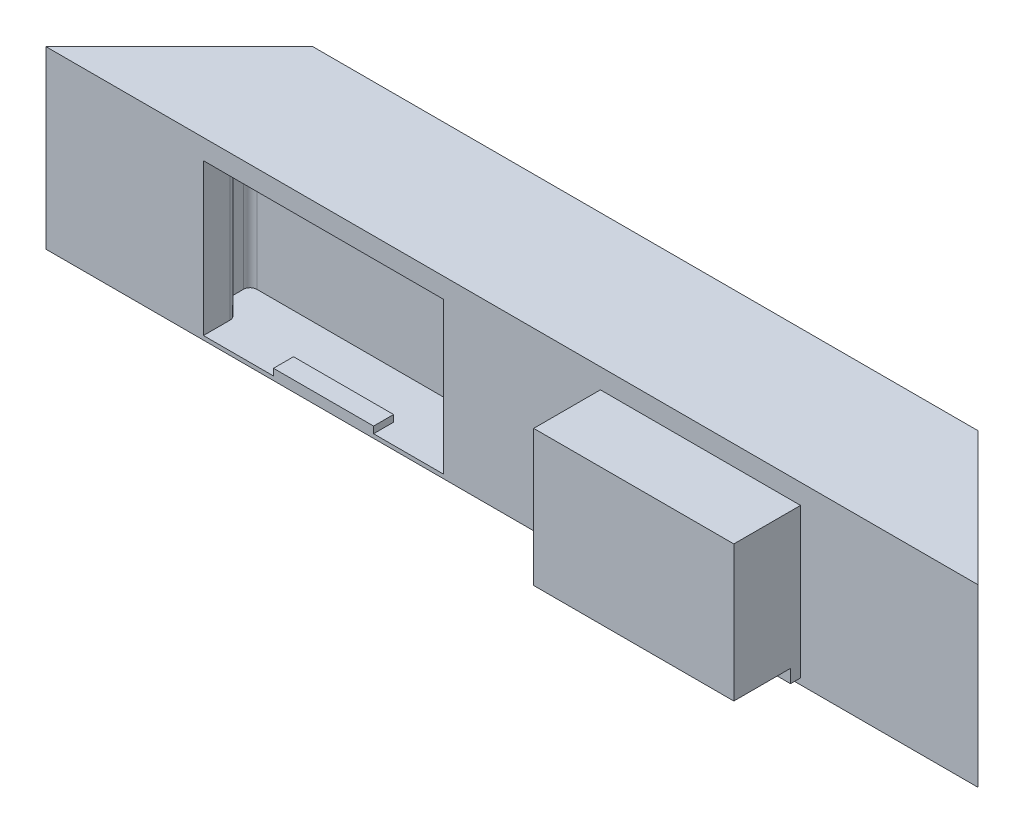
ISO-10303-21;
HEADER;
FILE_DESCRIPTION(('STEP AP214'),'2;1');
FILE_NAME('part.step','',(''),(''),'','','');
FILE_SCHEMA(('AUTOMOTIVE_DESIGN { 1 0 10303 214 1 1 1 1 }'));
ENDSEC;
DATA;
#1=APPLICATION_CONTEXT('core data for automotive mechanical design processes');
#2=APPLICATION_PROTOCOL_DEFINITION('international standard','automotive_design',2000,#1);
#3=PRODUCT_CONTEXT('',#1,'mechanical');
#4=PRODUCT('Part','Part','',(#3));
#5=PRODUCT_RELATED_PRODUCT_CATEGORY('part','',(#4));
#6=PRODUCT_DEFINITION_FORMATION('','',#4);
#7=PRODUCT_DEFINITION_CONTEXT('part definition',#1,'design');
#8=PRODUCT_DEFINITION('design','',#6,#7);
#9=PRODUCT_DEFINITION_SHAPE('','',#8);
#10=(LENGTH_UNIT() NAMED_UNIT(*) SI_UNIT(.MILLI.,.METRE.));
#11=(NAMED_UNIT(*) PLANE_ANGLE_UNIT() SI_UNIT($,.RADIAN.));
#12=(NAMED_UNIT(*) SI_UNIT($,.STERADIAN.) SOLID_ANGLE_UNIT());
#13=UNCERTAINTY_MEASURE_WITH_UNIT(LENGTH_MEASURE(1.E-05),#10,'distance_accuracy_value','');
#14=(GEOMETRIC_REPRESENTATION_CONTEXT(3) GLOBAL_UNCERTAINTY_ASSIGNED_CONTEXT((#13)) GLOBAL_UNIT_ASSIGNED_CONTEXT((#10,
#11,#12)) REPRESENTATION_CONTEXT('',''));
#15=CARTESIAN_POINT('',(0.,0.,0.));
#16=DIRECTION('',(0.,0.,1.));
#17=DIRECTION('',(1.,0.,0.));
#18=AXIS2_PLACEMENT_3D('',#15,#16,#17);
#19=CARTESIAN_POINT('',(0.,-12.55,0.));
#20=DIRECTION('',(0.,1.,0.));
#21=DIRECTION('',(0.,0.,1.));
#22=AXIS2_PLACEMENT_3D('',#19,#20,#21);
#23=PLANE('',#22);
#24=DIRECTION('',(1.,0.,0.));
#25=VECTOR('',#24,1.);
#26=CARTESIAN_POINT('',(400000.,-12.55,9.99999999999091));
#27=LINE('',#26,#25);
#28=CARTESIAN_POINT('',(-46.2499999999864,-12.55,9.99999999997163));
#29=VERTEX_POINT('',#28);
#30=CARTESIAN_POINT('',(-35.7499999999864,-12.55,9.99999999997163));
#31=VERTEX_POINT('',#30);
#32=EDGE_CURVE('E276',#29,#31,#27,.T.);
#33=ORIENTED_EDGE('',*,*,#32,.T.);
#34=DIRECTION('',(0.,0.,1.));
#35=VECTOR('',#34,1.);
#36=CARTESIAN_POINT('',(-35.7499999999864,-12.55,9.99999999997163));
#37=LINE('',#36,#35);
#38=CARTESIAN_POINT('',(-35.7499999999864,-12.55,6.99999999997163));
#39=VERTEX_POINT('',#38);
#40=EDGE_CURVE('E258',#39,#31,#37,.T.);
#41=ORIENTED_EDGE('',*,*,#40,.F.);
#42=DIRECTION('',(-1.,0.,0.));
#43=VECTOR('',#42,1.);
#44=CARTESIAN_POINT('',(-35.7499999999864,-12.55,6.99999999997163));
#45=LINE('',#44,#43);
#46=CARTESIAN_POINT('',(-20.7499999999864,-12.55,6.99999999997163));
#47=VERTEX_POINT('',#46);
#48=EDGE_CURVE('E254',#47,#39,#45,.T.);
#49=ORIENTED_EDGE('',*,*,#48,.F.);
#50=DIRECTION('',(0.,0.,-1.));
#51=VECTOR('',#50,1.);
#52=CARTESIAN_POINT('',(-20.7499999999864,-12.55,9.99999999997163));
#53=LINE('',#52,#51);
#54=CARTESIAN_POINT('',(-20.7499999999864,-12.55,9.99999999997163));
#55=VERTEX_POINT('',#54);
#56=EDGE_CURVE('E530',#55,#47,#53,.T.);
#57=ORIENTED_EDGE('',*,*,#56,.F.);
#58=CARTESIAN_POINT('',(-10.249999999985,-12.55,9.99999999999091));
#59=VERTEX_POINT('',#58);
#60=EDGE_CURVE('E274',#55,#59,#27,.T.);
#61=ORIENTED_EDGE('',*,*,#60,.T.);
#62=DIRECTION('',(0.,0.,1.));
#63=VECTOR('',#62,1.);
#64=CARTESIAN_POINT('',(-10.249999999985,-12.55,291589.));
#65=LINE('',#64,#63);
#66=CARTESIAN_POINT('',(-10.249999999985,-12.55,5.99999999997181));
#67=VERTEX_POINT('',#66);
#68=EDGE_CURVE('E279',#67,#59,#65,.T.);
#69=ORIENTED_EDGE('',*,*,#68,.F.);
#70=CARTESIAN_POINT('',(-9.25000000000864,-12.55,5.99999999999545));
#71=DIRECTION('',(0.,1.,0.));
#72=DIRECTION('',(0.,0.,1.));
#73=AXIS2_PLACEMENT_3D('',#70,#71,#72);
#74=CIRCLE('',#73,1.);
#75=CARTESIAN_POINT('',(-9.25000000000864,-12.55,4.99999999999545));
#76=VERTEX_POINT('',#75);
#77=EDGE_CURVE('E508',#67,#76,#74,.F.);
#78=ORIENTED_EDGE('',*,*,#77,.T.);
#79=DIRECTION('',(-1.,0.,0.));
#80=VECTOR('',#79,1.);
#81=CARTESIAN_POINT('',(400000.,-12.55,4.99999999999545));
#82=LINE('',#81,#80);
#83=CARTESIAN_POINT('',(-8.25000000003229,-12.55,4.99999999999545));
#84=VERTEX_POINT('',#83);
#85=EDGE_CURVE('E283',#84,#76,#82,.T.);
#86=ORIENTED_EDGE('',*,*,#85,.F.);
#87=CARTESIAN_POINT('',(-8.25000000000584,-12.55,4.0000000000191));
#88=DIRECTION('',(0.,1.,0.));
#89=DIRECTION('',(0.,0.,1.));
#90=AXIS2_PLACEMENT_3D('',#87,#88,#89);
#91=CIRCLE('',#90,1.);
#92=CARTESIAN_POINT('',(-7.25000000000584,-12.55,4.0000000000191));
#93=VERTEX_POINT('',#92);
#94=EDGE_CURVE('E471',#84,#93,#91,.T.);
#95=ORIENTED_EDGE('',*,*,#94,.T.);
#96=DIRECTION('',(0.,0.,1.));
#97=VECTOR('',#96,1.);
#98=CARTESIAN_POINT('',(-7.24999999960119,-12.55,291589.000000001));
#99=LINE('',#98,#97);
#100=CARTESIAN_POINT('',(-7.25000000000585,-12.55,0.999999999976353));
#101=VERTEX_POINT('',#100);
#102=EDGE_CURVE('E287',#101,#93,#99,.T.);
#103=ORIENTED_EDGE('',*,*,#102,.F.);
#104=CARTESIAN_POINT('',(-8.24999999997544,-12.55,0.99999999997842));
#105=DIRECTION('',(0.,1.,0.));
#106=DIRECTION('',(0.,0.,1.));
#107=AXIS2_PLACEMENT_3D('',#104,#105,#106);
#108=CIRCLE('',#107,1.);
#109=CARTESIAN_POINT('',(-8.24999999997544,-12.55,-2.15801371931173E-11));
#110=VERTEX_POINT('',#109);
#111=EDGE_CURVE('E474',#101,#110,#108,.T.);
#112=ORIENTED_EDGE('',*,*,#111,.T.);
#113=DIRECTION('',(-1.,0.,0.));
#114=VECTOR('',#113,1.);
#115=CARTESIAN_POINT('',(400000.,-12.55,5.6843418860808E-11));
#116=LINE('',#115,#114);
#117=CARTESIAN_POINT('',(-48.2499999999391,-12.55,-2.15879793869774E-11));
#118=VERTEX_POINT('',#117);
#119=EDGE_CURVE('E291',#110,#118,#116,.T.);
#120=ORIENTED_EDGE('',*,*,#119,.T.);
#121=CARTESIAN_POINT('',(-48.2499999999655,-12.55,0.999999999976353));
#122=DIRECTION('',(0.,1.,0.));
#123=DIRECTION('',(0.,0.,1.));
#124=AXIS2_PLACEMENT_3D('',#121,#122,#123);
#125=CIRCLE('',#124,1.);
#126=CARTESIAN_POINT('',(-49.2499999999655,-12.55,0.999999999976353));
#127=VERTEX_POINT('',#126);
#128=EDGE_CURVE('E465',#118,#127,#125,.T.);
#129=ORIENTED_EDGE('',*,*,#128,.T.);
#130=DIRECTION('',(0.,0.,1.));
#131=VECTOR('',#130,1.);
#132=CARTESIAN_POINT('',(-49.2500000003702,-12.55,291588.999999999));
#133=LINE('',#132,#131);
#134=CARTESIAN_POINT('',(-49.2499999999655,-12.55,4.0000000000191));
#135=VERTEX_POINT('',#134);
#136=EDGE_CURVE('E295',#127,#135,#133,.T.);
#137=ORIENTED_EDGE('',*,*,#136,.T.);
#138=CARTESIAN_POINT('',(-48.2499999999959,-12.55,3.99999999999545));
#139=DIRECTION('',(0.,1.,0.));
#140=DIRECTION('',(0.,0.,1.));
#141=AXIS2_PLACEMENT_3D('',#138,#139,#140);
#142=CIRCLE('',#141,1.);
#143=CARTESIAN_POINT('',(-48.2499999999959,-12.55,4.99999999999545));
#144=VERTEX_POINT('',#143);
#145=EDGE_CURVE('E468',#135,#144,#142,.T.);
#146=ORIENTED_EDGE('',*,*,#145,.T.);
#147=DIRECTION('',(1.,0.,0.));
#148=VECTOR('',#147,1.);
#149=CARTESIAN_POINT('',(400000.,-12.55,4.99999999999545));
#150=LINE('',#149,#148);
#151=CARTESIAN_POINT('',(-47.2499999999627,-12.55,4.99999999999545));
#152=VERTEX_POINT('',#151);
#153=EDGE_CURVE('E299',#144,#152,#150,.T.);
#154=ORIENTED_EDGE('',*,*,#153,.T.);
#155=CARTESIAN_POINT('',(-47.2499999999864,-12.55,5.99999999997181));
#156=DIRECTION('',(0.,1.,0.));
#157=DIRECTION('',(0.,0.,1.));
#158=AXIS2_PLACEMENT_3D('',#155,#156,#157);
#159=CIRCLE('',#158,1.);
#160=CARTESIAN_POINT('',(-46.2499999999864,-12.55,5.99999999997181));
#161=VERTEX_POINT('',#160);
#162=EDGE_CURVE('E514',#152,#161,#159,.F.);
#163=ORIENTED_EDGE('',*,*,#162,.T.);
#164=DIRECTION('',(0.,0.,1.));
#165=VECTOR('',#164,1.);
#166=CARTESIAN_POINT('',(-46.2499999999864,-12.55,291589.));
#167=LINE('',#166,#165);
#168=EDGE_CURVE('E271',#161,#29,#167,.T.);
#169=ORIENTED_EDGE('',*,*,#168,.T.);
#170=EDGE_LOOP('',(#33,#41,#49,#57,#61,#69,#78,#86,#95,#103,#112,#120,#129,#137,#146,#154,#163,#169));
#171=FACE_BOUND('',#170,.T.);
#172=ADVANCED_FACE('F41',(#171),#23,.T.);
#173=CARTESIAN_POINT('',(-69.8500000000001,13.15,10.));
#174=DIRECTION('',(0.,0.,-1.));
#175=DIRECTION('',(-1.,0.,0.));
#176=AXIS2_PLACEMENT_3D('',#173,#174,#175);
#177=PLANE('',#176);
#178=DIRECTION('',(1.,0.,0.));
#179=VECTOR('',#178,1.);
#180=CARTESIAN_POINT('',(13.2499999999999,-12.25,10.));
#181=LINE('',#180,#179);
#182=CARTESIAN_POINT('',(13.2499999999999,-12.25,10.));
#183=VERTEX_POINT('',#182);
#184=CARTESIAN_POINT('',(43.2499999999999,-12.25,10.));
#185=VERTEX_POINT('',#184);
#186=EDGE_CURVE('E341',#183,#185,#181,.T.);
#187=ORIENTED_EDGE('',*,*,#186,.F.);
#188=DIRECTION('',(0.,1.,0.));
#189=VECTOR('',#188,1.);
#190=CARTESIAN_POINT('',(13.2499999999999,-10.25,10.));
#191=LINE('',#190,#189);
#192=CARTESIAN_POINT('',(13.2499999999999,10.15,10.));
#193=VERTEX_POINT('',#192);
#194=EDGE_CURVE('E375',#183,#193,#191,.T.);
#195=ORIENTED_EDGE('',*,*,#194,.T.);
#196=DIRECTION('',(-1.,0.,0.));
#197=VECTOR('',#196,1.);
#198=CARTESIAN_POINT('',(43.2499999999999,10.15,10.));
#199=LINE('',#198,#197);
#200=CARTESIAN_POINT('',(43.2499999999999,10.15,10.));
#201=VERTEX_POINT('',#200);
#202=EDGE_CURVE('E362',#201,#193,#199,.T.);
#203=ORIENTED_EDGE('',*,*,#202,.F.);
#204=DIRECTION('',(0.,1.,0.));
#205=VECTOR('',#204,1.);
#206=CARTESIAN_POINT('',(43.2499999999999,-10.25,10.));
#207=LINE('',#206,#205);
#208=EDGE_CURVE('E389',#185,#201,#207,.T.);
#209=ORIENTED_EDGE('',*,*,#208,.F.);
#210=EDGE_LOOP('',(#187,#195,#203,#209));
#211=FACE_BOUND('',#210,.T.);
#212=DIRECTION('',(1.,0.,0.));
#213=VECTOR('',#212,1.);
#214=CARTESIAN_POINT('',(-69.8500000000001,-13.15,10.));
#215=LINE('',#214,#213);
#216=CARTESIAN_POINT('',(-69.8500000000001,-13.15,10.));
#217=VERTEX_POINT('',#216);
#218=CARTESIAN_POINT('',(69.8499999999999,-13.15,10.));
#219=VERTEX_POINT('',#218);
#220=EDGE_CURVE('E420',#217,#219,#215,.T.);
#221=ORIENTED_EDGE('',*,*,#220,.T.);
#222=DIRECTION('',(0.,-1.,0.));
#223=VECTOR('',#222,1.);
#224=CARTESIAN_POINT('',(69.8499999999999,13.15,10.));
#225=LINE('',#224,#223);
#226=CARTESIAN_POINT('',(69.8499999999999,13.15,10.));
#227=VERTEX_POINT('',#226);
#228=EDGE_CURVE('E431',#227,#219,#225,.T.);
#229=ORIENTED_EDGE('',*,*,#228,.F.);
#230=DIRECTION('',(1.,0.,0.));
#231=VECTOR('',#230,1.);
#232=CARTESIAN_POINT('',(-69.8500000000001,13.15,10.));
#233=LINE('',#232,#231);
#234=CARTESIAN_POINT('',(-69.8500000000001,13.15,10.));
#235=VERTEX_POINT('',#234);
#236=EDGE_CURVE('E407',#235,#227,#233,.T.);
#237=ORIENTED_EDGE('',*,*,#236,.F.);
#238=DIRECTION('',(0.,-1.,0.));
#239=VECTOR('',#238,1.);
#240=CARTESIAN_POINT('',(-69.8500000000001,13.15,10.));
#241=LINE('',#240,#239);
#242=EDGE_CURVE('E435',#235,#217,#241,.T.);
#243=ORIENTED_EDGE('',*,*,#242,.T.);
#244=EDGE_LOOP('',(#221,#229,#237,#243));
#245=FACE_BOUND('',#244,.T.);
#246=ORIENTED_EDGE('',*,*,#32,.F.);
#247=DIRECTION('',(0.,1.,0.));
#248=VECTOR('',#247,1.);
#249=CARTESIAN_POINT('',(-46.2499999999864,-12.55,9.99999999997163));
#250=LINE('',#249,#248);
#251=CARTESIAN_POINT('',(-46.2499999999864,10.15,9.99999999997163));
#252=VERTEX_POINT('',#251);
#253=EDGE_CURVE('E302',#29,#252,#250,.T.);
#254=ORIENTED_EDGE('',*,*,#253,.T.);
#255=DIRECTION('',(1.,0.,0.));
#256=VECTOR('',#255,1.);
#257=CARTESIAN_POINT('',(400000.,10.15,9.99999999999091));
#258=LINE('',#257,#256);
#259=CARTESIAN_POINT('',(-10.249999999985,10.15,10.));
#260=VERTEX_POINT('',#259);
#261=EDGE_CURVE('E265',#252,#260,#258,.T.);
#262=ORIENTED_EDGE('',*,*,#261,.T.);
#263=DIRECTION('',(0.,1.,0.));
#264=VECTOR('',#263,1.);
#265=CARTESIAN_POINT('',(-10.249999999985,-12.55,9.99999999999091));
#266=LINE('',#265,#264);
#267=EDGE_CURVE('E329',#59,#260,#266,.T.);
#268=ORIENTED_EDGE('',*,*,#267,.F.);
#269=ORIENTED_EDGE('',*,*,#60,.F.);
#270=DIRECTION('',(0.,-1.,0.));
#271=VECTOR('',#270,1.);
#272=CARTESIAN_POINT('',(-20.7499999999864,-11.55,9.99999999997163));
#273=LINE('',#272,#271);
#274=CARTESIAN_POINT('',(-20.7499999999864,-11.55,9.99999999997163));
#275=VERTEX_POINT('',#274);
#276=EDGE_CURVE('E239',#275,#55,#273,.T.);
#277=ORIENTED_EDGE('',*,*,#276,.F.);
#278=DIRECTION('',(1.,0.,0.));
#279=VECTOR('',#278,1.);
#280=CARTESIAN_POINT('',(-35.7499999999864,-11.55,9.99999999997163));
#281=LINE('',#280,#279);
#282=CARTESIAN_POINT('',(-35.7499999999864,-11.55,9.99999999997163));
#283=VERTEX_POINT('',#282);
#284=EDGE_CURVE('E231',#283,#275,#281,.T.);
#285=ORIENTED_EDGE('',*,*,#284,.F.);
#286=DIRECTION('',(0.,-1.,0.));
#287=VECTOR('',#286,1.);
#288=CARTESIAN_POINT('',(-35.7499999999864,-11.55,9.99999999997163));
#289=LINE('',#288,#287);
#290=EDGE_CURVE('E236',#283,#31,#289,.T.);
#291=ORIENTED_EDGE('',*,*,#290,.T.);
#292=EDGE_LOOP('',(#246,#254,#262,#268,#269,#277,#285,#291));
#293=FACE_BOUND('',#292,.T.);
#294=ADVANCED_FACE('F234',(#211,#245,#293),#177,.F.);
#295=CARTESIAN_POINT('',(0.,-10.25,0.));
#296=DIRECTION('',(0.,1.,0.));
#297=DIRECTION('',(0.,0.,1.));
#298=AXIS2_PLACEMENT_3D('',#295,#296,#297);
#299=PLANE('',#298);
#300=DIRECTION('',(-1.,0.,0.));
#301=VECTOR('',#300,1.);
#302=CARTESIAN_POINT('',(13.2499999999999,-10.25,11.5));
#303=LINE('',#302,#301);
#304=CARTESIAN_POINT('',(43.2499999999999,-10.25,11.5));
#305=VERTEX_POINT('',#304);
#306=CARTESIAN_POINT('',(13.2499999999999,-10.25,11.5));
#307=VERTEX_POINT('',#306);
#308=EDGE_CURVE('E333',#305,#307,#303,.T.);
#309=ORIENTED_EDGE('',*,*,#308,.F.);
#310=DIRECTION('',(0.,0.,-1.));
#311=VECTOR('',#310,1.);
#312=CARTESIAN_POINT('',(43.2499999999999,-10.25,10.));
#313=LINE('',#312,#311);
#314=CARTESIAN_POINT('',(43.2499999999999,-10.25,20.));
#315=VERTEX_POINT('',#314);
#316=EDGE_CURVE('E371',#315,#305,#313,.T.);
#317=ORIENTED_EDGE('',*,*,#316,.F.);
#318=DIRECTION('',(1.,0.,0.));
#319=VECTOR('',#318,1.);
#320=CARTESIAN_POINT('',(43.2499999999999,-10.25,20.));
#321=LINE('',#320,#319);
#322=CARTESIAN_POINT('',(13.2499999999999,-10.25,20.));
#323=VERTEX_POINT('',#322);
#324=EDGE_CURVE('E366',#323,#315,#321,.T.);
#325=ORIENTED_EDGE('',*,*,#324,.F.);
#326=DIRECTION('',(0.,0.,1.));
#327=VECTOR('',#326,1.);
#328=CARTESIAN_POINT('',(13.2499999999999,-10.25,10.));
#329=LINE('',#328,#327);
#330=EDGE_CURVE('E363',#307,#323,#329,.T.);
#331=ORIENTED_EDGE('',*,*,#330,.F.);
#332=EDGE_LOOP('',(#309,#317,#325,#331));
#333=FACE_BOUND('',#332,.T.);
#334=ADVANCED_FACE('F624',(#333),#299,.F.);
#335=CARTESIAN_POINT('',(-69.8500000000001,13.15,10.));
#336=DIRECTION('',(0.707106781186549,0.,0.707106781186546));
#337=DIRECTION('',(0.707106781186546,0.,-0.707106781186549));
#338=AXIS2_PLACEMENT_3D('',#335,#336,#337);
#339=PLANE('',#338);
#340=DIRECTION('',(0.,-1.,0.));
#341=VECTOR('',#340,1.);
#342=CARTESIAN_POINT('',(-49.8500000000001,13.15,-9.99999999999999));
#343=LINE('',#342,#341);
#344=CARTESIAN_POINT('',(-49.8500000000001,13.15,-9.99999999999999));
#345=VERTEX_POINT('',#344);
#346=CARTESIAN_POINT('',(-49.8500000000001,-8.14999999999998,-9.99999999999999));
#347=VERTEX_POINT('',#346);
#348=EDGE_CURVE('E417',#345,#347,#343,.T.);
#349=ORIENTED_EDGE('',*,*,#348,.T.);
#350=DIRECTION('',(0.577350269189625,0.577350269189625,-0.577350269189627));
#351=VECTOR('',#350,1.);
#352=CARTESIAN_POINT('',(-49.8500000000001,-8.14999999999998,-9.99999999999999));
#353=LINE('',#352,#351);
#354=CARTESIAN_POINT('',(-54.8500000000001,-13.15,-4.99999999999996));
#355=VERTEX_POINT('',#354);
#356=EDGE_CURVE('E64',#347,#355,#353,.F.);
#357=ORIENTED_EDGE('',*,*,#356,.T.);
#358=DIRECTION('',(-0.707106781186546,0.,0.707106781186549));
#359=VECTOR('',#358,1.);
#360=CARTESIAN_POINT('',(-69.8500000000001,-13.15,10.));
#361=LINE('',#360,#359);
#362=EDGE_CURVE('E393',#355,#217,#361,.T.);
#363=ORIENTED_EDGE('',*,*,#362,.T.);
#364=ORIENTED_EDGE('',*,*,#242,.F.);
#365=DIRECTION('',(-0.707106781186546,0.,0.707106781186549));
#366=VECTOR('',#365,1.);
#367=CARTESIAN_POINT('',(-69.8500000000001,13.15,10.));
#368=LINE('',#367,#366);
#369=EDGE_CURVE('E403',#345,#235,#368,.T.);
#370=ORIENTED_EDGE('',*,*,#369,.F.);
#371=EDGE_LOOP('',(#349,#357,#363,#364,#370));
#372=FACE_BOUND('',#371,.T.);
#373=ADVANCED_FACE('F655',(#372),#339,.F.);
#374=CARTESIAN_POINT('',(69.8499999999999,13.15,10.));
#375=DIRECTION('',(-0.707106781186544,0.,0.707106781186552));
#376=DIRECTION('',(0.707106781186552,0.,0.707106781186544));
#377=AXIS2_PLACEMENT_3D('',#374,#375,#376);
#378=PLANE('',#377);
#379=DIRECTION('',(-0.707106781186552,0.,-0.707106781186544));
#380=VECTOR('',#379,1.);
#381=CARTESIAN_POINT('',(69.8499999999999,-13.15,10.));
#382=LINE('',#381,#380);
#383=CARTESIAN_POINT('',(54.8499999999998,-13.15,-4.99999999999996));
#384=VERTEX_POINT('',#383);
#385=EDGE_CURVE('E408',#219,#384,#382,.T.);
#386=ORIENTED_EDGE('',*,*,#385,.T.);
#387=DIRECTION('',(0.577350269189631,-0.577350269189623,0.577350269189624));
#388=VECTOR('',#387,1.);
#389=CARTESIAN_POINT('',(16.6166666666659,25.0833333333334,-43.2333333333335));
#390=LINE('',#389,#388);
#391=CARTESIAN_POINT('',(49.8499999999997,-8.14999999999998,-9.99999999999999));
#392=VERTEX_POINT('',#391);
#393=EDGE_CURVE('E11',#384,#392,#390,.F.);
#394=ORIENTED_EDGE('',*,*,#393,.T.);
#395=DIRECTION('',(0.,-1.,0.));
#396=VECTOR('',#395,1.);
#397=CARTESIAN_POINT('',(49.8499999999997,13.15,-9.99999999999999));
#398=LINE('',#397,#396);
#399=CARTESIAN_POINT('',(49.8499999999997,13.15,-9.99999999999999));
#400=VERTEX_POINT('',#399);
#401=EDGE_CURVE('E427',#400,#392,#398,.T.);
#402=ORIENTED_EDGE('',*,*,#401,.F.);
#403=DIRECTION('',(-0.707106781186552,0.,-0.707106781186544));
#404=VECTOR('',#403,1.);
#405=CARTESIAN_POINT('',(69.8499999999999,13.15,10.));
#406=LINE('',#405,#404);
#407=EDGE_CURVE('E411',#227,#400,#406,.T.);
#408=ORIENTED_EDGE('',*,*,#407,.F.);
#409=ORIENTED_EDGE('',*,*,#228,.T.);
#410=EDGE_LOOP('',(#386,#394,#402,#408,#409));
#411=FACE_BOUND('',#410,.T.);
#412=ADVANCED_FACE('F682',(#411),#378,.F.);
#413=CARTESIAN_POINT('',(-49.8500000000001,13.15,-9.99999999999999));
#414=DIRECTION('',(0.,0.,1.));
#415=DIRECTION('',(1.,0.,0.));
#416=AXIS2_PLACEMENT_3D('',#413,#414,#415);
#417=PLANE('',#416);
#418=ORIENTED_EDGE('',*,*,#401,.T.);
#419=DIRECTION('',(-1.,0.,0.));
#420=VECTOR('',#419,1.);
#421=CARTESIAN_POINT('',(-49.8500000000001,-8.14999999999998,-9.99999999999999));
#422=LINE('',#421,#420);
#423=EDGE_CURVE('E517',#392,#347,#422,.T.);
#424=ORIENTED_EDGE('',*,*,#423,.T.);
#425=ORIENTED_EDGE('',*,*,#348,.F.);
#426=DIRECTION('',(-1.,0.,0.));
#427=VECTOR('',#426,1.);
#428=CARTESIAN_POINT('',(-49.8500000000001,13.15,-9.99999999999999));
#429=LINE('',#428,#427);
#430=EDGE_CURVE('E414',#400,#345,#429,.T.);
#431=ORIENTED_EDGE('',*,*,#430,.F.);
#432=EDGE_LOOP('',(#418,#424,#425,#431));
#433=FACE_BOUND('',#432,.T.);
#434=ADVANCED_FACE('F676',(#433),#417,.F.);
#435=CARTESIAN_POINT('',(0.,13.15,0.));
#436=DIRECTION('',(0.,1.,0.));
#437=DIRECTION('',(0.,0.,1.));
#438=AXIS2_PLACEMENT_3D('',#435,#436,#437);
#439=PLANE('',#438);
#440=ORIENTED_EDGE('',*,*,#369,.T.);
#441=ORIENTED_EDGE('',*,*,#236,.T.);
#442=ORIENTED_EDGE('',*,*,#407,.T.);
#443=ORIENTED_EDGE('',*,*,#430,.T.);
#444=EDGE_LOOP('',(#440,#441,#442,#443));
#445=FACE_BOUND('',#444,.T.);
#446=ADVANCED_FACE('F673',(#445),#439,.T.);
#447=CARTESIAN_POINT('',(0.,-13.15,0.));
#448=DIRECTION('',(0.,1.,0.));
#449=DIRECTION('',(0.,0.,1.));
#450=AXIS2_PLACEMENT_3D('',#447,#448,#449);
#451=PLANE('',#450);
#452=ORIENTED_EDGE('',*,*,#362,.F.);
#453=DIRECTION('',(1.,0.,0.));
#454=VECTOR('',#453,1.);
#455=CARTESIAN_POINT('',(0.,-13.15,-4.99999999999996));
#456=LINE('',#455,#454);
#457=EDGE_CURVE('E50',#355,#384,#456,.T.);
#458=ORIENTED_EDGE('',*,*,#457,.T.);
#459=ORIENTED_EDGE('',*,*,#385,.F.);
#460=ORIENTED_EDGE('',*,*,#220,.F.);
#461=EDGE_LOOP('',(#452,#458,#459,#460));
#462=FACE_BOUND('',#461,.T.);
#463=ADVANCED_FACE('F665',(#462),#451,.F.);
#464=CARTESIAN_POINT('',(43.2499999999999,-10.25,10.));
#465=DIRECTION('',(1.,0.,0.));
#466=DIRECTION('',(0.,0.,-1.));
#467=AXIS2_PLACEMENT_3D('',#464,#465,#466);
#468=PLANE('',#467);
#469=DIRECTION('',(0.,0.,-1.));
#470=VECTOR('',#469,1.);
#471=CARTESIAN_POINT('',(43.2499999999999,10.15,10.));
#472=LINE('',#471,#470);
#473=CARTESIAN_POINT('',(43.2499999999999,10.15,20.));
#474=VERTEX_POINT('',#473);
#475=EDGE_CURVE('E367',#474,#201,#472,.T.);
#476=ORIENTED_EDGE('',*,*,#475,.F.);
#477=DIRECTION('',(0.,1.,0.));
#478=VECTOR('',#477,1.);
#479=CARTESIAN_POINT('',(43.2499999999999,-10.25,20.));
#480=LINE('',#479,#478);
#481=EDGE_CURVE('E394',#315,#474,#480,.T.);
#482=ORIENTED_EDGE('',*,*,#481,.F.);
#483=ORIENTED_EDGE('',*,*,#316,.T.);
#484=DIRECTION('',(0.,1.,0.));
#485=VECTOR('',#484,1.);
#486=CARTESIAN_POINT('',(43.2499999999999,-12.25,11.5));
#487=LINE('',#486,#485);
#488=CARTESIAN_POINT('',(43.2499999999999,-12.25,11.5));
#489=VERTEX_POINT('',#488);
#490=EDGE_CURVE('E358',#489,#305,#487,.T.);
#491=ORIENTED_EDGE('',*,*,#490,.F.);
#492=DIRECTION('',(0.,0.,1.));
#493=VECTOR('',#492,1.);
#494=CARTESIAN_POINT('',(43.2499999999999,-12.25,10.));
#495=LINE('',#494,#493);
#496=EDGE_CURVE('E345',#185,#489,#495,.T.);
#497=ORIENTED_EDGE('',*,*,#496,.F.);
#498=ORIENTED_EDGE('',*,*,#208,.T.);
#499=EDGE_LOOP('',(#476,#482,#483,#491,#497,#498));
#500=FACE_BOUND('',#499,.T.);
#501=ADVANCED_FACE('F661',(#500),#468,.T.);
#502=CARTESIAN_POINT('',(43.2499999999999,-10.25,20.));
#503=DIRECTION('',(0.,0.,1.));
#504=DIRECTION('',(1.,0.,0.));
#505=AXIS2_PLACEMENT_3D('',#502,#503,#504);
#506=PLANE('',#505);
#507=DIRECTION('',(1.,0.,0.));
#508=VECTOR('',#507,1.);
#509=CARTESIAN_POINT('',(43.2499999999999,10.15,20.));
#510=LINE('',#509,#508);
#511=CARTESIAN_POINT('',(13.2499999999999,10.15,20.));
#512=VERTEX_POINT('',#511);
#513=EDGE_CURVE('E383',#512,#474,#510,.T.);
#514=ORIENTED_EDGE('',*,*,#513,.F.);
#515=DIRECTION('',(0.,1.,0.));
#516=VECTOR('',#515,1.);
#517=CARTESIAN_POINT('',(13.2499999999999,-10.25,20.));
#518=LINE('',#517,#516);
#519=EDGE_CURVE('E397',#323,#512,#518,.T.);
#520=ORIENTED_EDGE('',*,*,#519,.F.);
#521=ORIENTED_EDGE('',*,*,#324,.T.);
#522=ORIENTED_EDGE('',*,*,#481,.T.);
#523=EDGE_LOOP('',(#514,#520,#521,#522));
#524=FACE_BOUND('',#523,.T.);
#525=ADVANCED_FACE('F664',(#524),#506,.T.);
#526=CARTESIAN_POINT('',(13.2499999999999,-10.25,10.));
#527=DIRECTION('',(-1.,0.,0.));
#528=DIRECTION('',(0.,0.,1.));
#529=AXIS2_PLACEMENT_3D('',#526,#527,#528);
#530=PLANE('',#529);
#531=DIRECTION('',(0.,0.,1.));
#532=VECTOR('',#531,1.);
#533=CARTESIAN_POINT('',(13.2499999999999,10.15,10.));
#534=LINE('',#533,#532);
#535=EDGE_CURVE('E379',#193,#512,#534,.T.);
#536=ORIENTED_EDGE('',*,*,#535,.F.);
#537=ORIENTED_EDGE('',*,*,#194,.F.);
#538=DIRECTION('',(0.,0.,-1.));
#539=VECTOR('',#538,1.);
#540=CARTESIAN_POINT('',(13.2499999999999,-12.25,10.));
#541=LINE('',#540,#539);
#542=CARTESIAN_POINT('',(13.2499999999999,-12.25,11.5));
#543=VERTEX_POINT('',#542);
#544=EDGE_CURVE('E337',#543,#183,#541,.T.);
#545=ORIENTED_EDGE('',*,*,#544,.F.);
#546=DIRECTION('',(0.,1.,0.));
#547=VECTOR('',#546,1.);
#548=CARTESIAN_POINT('',(13.2499999999999,-12.25,11.5));
#549=LINE('',#548,#547);
#550=EDGE_CURVE('E351',#543,#307,#549,.T.);
#551=ORIENTED_EDGE('',*,*,#550,.T.);
#552=ORIENTED_EDGE('',*,*,#330,.T.);
#553=ORIENTED_EDGE('',*,*,#519,.T.);
#554=EDGE_LOOP('',(#536,#537,#545,#551,#552,#553));
#555=FACE_BOUND('',#554,.T.);
#556=ADVANCED_FACE('F659',(#555),#530,.T.);
#557=CARTESIAN_POINT('',(0.,10.15,0.));
#558=DIRECTION('',(0.,1.,0.));
#559=DIRECTION('',(0.,0.,1.));
#560=AXIS2_PLACEMENT_3D('',#557,#558,#559);
#561=PLANE('',#560);
#562=ORIENTED_EDGE('',*,*,#202,.T.);
#563=ORIENTED_EDGE('',*,*,#535,.T.);
#564=ORIENTED_EDGE('',*,*,#513,.T.);
#565=ORIENTED_EDGE('',*,*,#475,.T.);
#566=EDGE_LOOP('',(#562,#563,#564,#565));
#567=FACE_BOUND('',#566,.T.);
#568=ADVANCED_FACE('F651',(#567),#561,.T.);
#569=CARTESIAN_POINT('',(13.2499999999999,-12.25,11.5));
#570=DIRECTION('',(0.,0.,-1.));
#571=DIRECTION('',(-1.,0.,0.));
#572=AXIS2_PLACEMENT_3D('',#569,#570,#571);
#573=PLANE('',#572);
#574=ORIENTED_EDGE('',*,*,#308,.T.);
#575=ORIENTED_EDGE('',*,*,#550,.F.);
#576=DIRECTION('',(-1.,0.,0.));
#577=VECTOR('',#576,1.);
#578=CARTESIAN_POINT('',(13.2499999999999,-12.25,11.5));
#579=LINE('',#578,#577);
#580=EDGE_CURVE('E348',#489,#543,#579,.T.);
#581=ORIENTED_EDGE('',*,*,#580,.F.);
#582=ORIENTED_EDGE('',*,*,#490,.T.);
#583=EDGE_LOOP('',(#574,#575,#581,#582));
#584=FACE_BOUND('',#583,.T.);
#585=ADVANCED_FACE('F647',(#584),#573,.F.);
#586=CARTESIAN_POINT('',(0.,-12.25,0.));
#587=DIRECTION('',(0.,1.,0.));
#588=DIRECTION('',(0.,0.,1.));
#589=AXIS2_PLACEMENT_3D('',#586,#587,#588);
#590=PLANE('',#589);
#591=ORIENTED_EDGE('',*,*,#544,.T.);
#592=ORIENTED_EDGE('',*,*,#186,.T.);
#593=ORIENTED_EDGE('',*,*,#496,.T.);
#594=ORIENTED_EDGE('',*,*,#580,.T.);
#595=EDGE_LOOP('',(#591,#592,#593,#594));
#596=FACE_BOUND('',#595,.T.);
#597=ADVANCED_FACE('F644',(#596),#590,.F.);
#598=CARTESIAN_POINT('',(-46.2499999999864,-12.55,291589.));
#599=DIRECTION('',(-1.,0.,0.));
#600=DIRECTION('',(0.,0.,1.));
#601=AXIS2_PLACEMENT_3D('',#598,#599,#600);
#602=PLANE('',#601);
#603=ORIENTED_EDGE('',*,*,#168,.F.);
#604=DIRECTION('',(0.,1.,0.));
#605=VECTOR('',#604,1.);
#606=CARTESIAN_POINT('',(-46.2499999999864,-12.55,5.99999999997181));
#607=LINE('',#606,#605);
#608=CARTESIAN_POINT('',(-46.2499999999864,10.15,5.99999999997181));
#609=VERTEX_POINT('',#608);
#610=EDGE_CURVE('E501',#161,#609,#607,.T.);
#611=ORIENTED_EDGE('',*,*,#610,.T.);
#612=DIRECTION('',(0.,0.,1.));
#613=VECTOR('',#612,1.);
#614=CARTESIAN_POINT('',(-46.2499999999864,10.15,291589.));
#615=LINE('',#614,#613);
#616=EDGE_CURVE('E261',#609,#252,#615,.T.);
#617=ORIENTED_EDGE('',*,*,#616,.T.);
#618=ORIENTED_EDGE('',*,*,#253,.F.);
#619=EDGE_LOOP('',(#603,#611,#617,#618));
#620=FACE_BOUND('',#619,.T.);
#621=ADVANCED_FACE('F591',(#620),#602,.F.);
#622=CARTESIAN_POINT('',(400000.,-12.55,4.99999999999545));
#623=DIRECTION('',(0.,0.,1.));
#624=DIRECTION('',(1.,0.,0.));
#625=AXIS2_PLACEMENT_3D('',#622,#623,#624);
#626=PLANE('',#625);
#627=ORIENTED_EDGE('',*,*,#153,.F.);
#628=DIRECTION('',(0.,1.,0.));
#629=VECTOR('',#628,1.);
#630=CARTESIAN_POINT('',(-48.2499999999959,10.15,4.99999999999545));
#631=LINE('',#630,#629);
#632=CARTESIAN_POINT('',(-48.2499999999959,10.15,4.99999999999545));
#633=VERTEX_POINT('',#632);
#634=EDGE_CURVE('E490',#144,#633,#631,.T.);
#635=ORIENTED_EDGE('',*,*,#634,.T.);
#636=DIRECTION('',(1.,0.,0.));
#637=VECTOR('',#636,1.);
#638=CARTESIAN_POINT('',(400000.,10.15,4.99999999999545));
#639=LINE('',#638,#637);
#640=CARTESIAN_POINT('',(-47.2499999999627,10.15,4.99999999999545));
#641=VERTEX_POINT('',#640);
#642=EDGE_CURVE('E275',#633,#641,#639,.T.);
#643=ORIENTED_EDGE('',*,*,#642,.T.);
#644=DIRECTION('',(0.,1.,0.));
#645=VECTOR('',#644,1.);
#646=CARTESIAN_POINT('',(-47.2499999999627,-12.55,4.99999999999545));
#647=LINE('',#646,#645);
#648=EDGE_CURVE('E487',#641,#152,#647,.F.);
#649=ORIENTED_EDGE('',*,*,#648,.T.);
#650=EDGE_LOOP('',(#627,#635,#643,#649));
#651=FACE_BOUND('',#650,.T.);
#652=ADVANCED_FACE('F583',(#651),#626,.F.);
#653=CARTESIAN_POINT('',(-49.2500000003702,-12.55,291588.999999999));
#654=DIRECTION('',(-1.,0.,0.));
#655=DIRECTION('',(0.,0.,1.));
#656=AXIS2_PLACEMENT_3D('',#653,#654,#655);
#657=PLANE('',#656);
#658=DIRECTION('',(0.,0.,1.));
#659=VECTOR('',#658,1.);
#660=CARTESIAN_POINT('',(-49.2500000003702,10.15,291588.999999999));
#661=LINE('',#660,#659);
#662=CARTESIAN_POINT('',(-49.2499999999655,10.15,0.999999999976353));
#663=VERTEX_POINT('',#662);
#664=CARTESIAN_POINT('',(-49.2499999999655,10.15,4.0000000000191));
#665=VERTEX_POINT('',#664);
#666=EDGE_CURVE('E322',#663,#665,#661,.T.);
#667=ORIENTED_EDGE('',*,*,#666,.T.);
#668=DIRECTION('',(0.,1.,0.));
#669=VECTOR('',#668,1.);
#670=CARTESIAN_POINT('',(-49.2499999999655,-12.55,3.99999999999545));
#671=LINE('',#670,#669);
#672=EDGE_CURVE('E498',#665,#135,#671,.F.);
#673=ORIENTED_EDGE('',*,*,#672,.T.);
#674=ORIENTED_EDGE('',*,*,#136,.F.);
#675=DIRECTION('',(0.,1.,0.));
#676=VECTOR('',#675,1.);
#677=CARTESIAN_POINT('',(-49.2499999999655,10.15,0.999999999976352));
#678=LINE('',#677,#676);
#679=EDGE_CURVE('E494',#127,#663,#678,.T.);
#680=ORIENTED_EDGE('',*,*,#679,.T.);
#681=EDGE_LOOP('',(#667,#673,#674,#680));
#682=FACE_BOUND('',#681,.T.);
#683=ADVANCED_FACE('F574',(#682),#657,.F.);
#684=CARTESIAN_POINT('',(400000.,-12.55,5.6843418860808E-11));
#685=DIRECTION('',(0.,0.,-1.));
#686=DIRECTION('',(-1.,0.,0.));
#687=AXIS2_PLACEMENT_3D('',#684,#685,#686);
#688=PLANE('',#687);
#689=ORIENTED_EDGE('',*,*,#119,.F.);
#690=DIRECTION('',(0.,1.,0.));
#691=VECTOR('',#690,1.);
#692=CARTESIAN_POINT('',(-8.24999999997544,-12.55,-2.15801371931173E-11));
#693=LINE('',#692,#691);
#694=CARTESIAN_POINT('',(-8.24999999997544,10.15,-2.15801371931173E-11));
#695=VERTEX_POINT('',#694);
#696=EDGE_CURVE('E442',#110,#695,#693,.T.);
#697=ORIENTED_EDGE('',*,*,#696,.T.);
#698=DIRECTION('',(-1.,0.,0.));
#699=VECTOR('',#698,1.);
#700=CARTESIAN_POINT('',(400000.,10.15,5.6843418860808E-11));
#701=LINE('',#700,#699);
#702=CARTESIAN_POINT('',(-48.2499999999391,10.15,-2.15879793869774E-11));
#703=VERTEX_POINT('',#702);
#704=EDGE_CURVE('E318',#695,#703,#701,.T.);
#705=ORIENTED_EDGE('',*,*,#704,.T.);
#706=DIRECTION('',(0.,1.,0.));
#707=VECTOR('',#706,1.);
#708=CARTESIAN_POINT('',(-48.2499999999655,-12.55,-2.15879831372279E-11));
#709=LINE('',#708,#707);
#710=EDGE_CURVE('E439',#703,#118,#709,.F.);
#711=ORIENTED_EDGE('',*,*,#710,.T.);
#712=EDGE_LOOP('',(#689,#697,#705,#711));
#713=FACE_BOUND('',#712,.T.);
#714=ADVANCED_FACE('F566',(#713),#688,.F.);
#715=CARTESIAN_POINT('',(-7.24999999960119,-12.55,291589.000000001));
#716=DIRECTION('',(-1.,0.,0.));
#717=DIRECTION('',(0.,0.,1.));
#718=AXIS2_PLACEMENT_3D('',#715,#716,#717);
#719=PLANE('',#718);
#720=DIRECTION('',(0.,0.,1.));
#721=VECTOR('',#720,1.);
#722=CARTESIAN_POINT('',(-7.24999999960119,10.15,291589.000000001));
#723=LINE('',#722,#721);
#724=CARTESIAN_POINT('',(-7.25000000000585,10.15,0.999999999976353));
#725=VERTEX_POINT('',#724);
#726=CARTESIAN_POINT('',(-7.25000000000584,10.15,4.0000000000191));
#727=VERTEX_POINT('',#726);
#728=EDGE_CURVE('E314',#725,#727,#723,.T.);
#729=ORIENTED_EDGE('',*,*,#728,.F.);
#730=DIRECTION('',(0.,1.,0.));
#731=VECTOR('',#730,1.);
#732=CARTESIAN_POINT('',(-7.25000000000585,-12.55,0.999999999976353));
#733=LINE('',#732,#731);
#734=EDGE_CURVE('E462',#725,#101,#733,.F.);
#735=ORIENTED_EDGE('',*,*,#734,.T.);
#736=ORIENTED_EDGE('',*,*,#102,.T.);
#737=DIRECTION('',(0.,1.,0.));
#738=VECTOR('',#737,1.);
#739=CARTESIAN_POINT('',(-7.25000000000584,10.15,4.0000000000191));
#740=LINE('',#739,#738);
#741=EDGE_CURVE('E458',#93,#727,#740,.T.);
#742=ORIENTED_EDGE('',*,*,#741,.T.);
#743=EDGE_LOOP('',(#729,#735,#736,#742));
#744=FACE_BOUND('',#743,.T.);
#745=ADVANCED_FACE('F558',(#744),#719,.T.);
#746=CARTESIAN_POINT('',(400000.,-12.55,4.99999999999545));
#747=DIRECTION('',(0.,0.,-1.));
#748=DIRECTION('',(-1.,0.,0.));
#749=AXIS2_PLACEMENT_3D('',#746,#747,#748);
#750=PLANE('',#749);
#751=DIRECTION('',(-1.,0.,0.));
#752=VECTOR('',#751,1.);
#753=CARTESIAN_POINT('',(400000.,10.15,4.99999999999545));
#754=LINE('',#753,#752);
#755=CARTESIAN_POINT('',(-8.25000000003229,10.15,4.99999999999545));
#756=VERTEX_POINT('',#755);
#757=CARTESIAN_POINT('',(-9.25000000000864,10.15,4.99999999999545));
#758=VERTEX_POINT('',#757);
#759=EDGE_CURVE('E310',#756,#758,#754,.T.);
#760=ORIENTED_EDGE('',*,*,#759,.F.);
#761=DIRECTION('',(0.,1.,0.));
#762=VECTOR('',#761,1.);
#763=CARTESIAN_POINT('',(-8.25000000000584,-12.55,4.99999999999545));
#764=LINE('',#763,#762);
#765=EDGE_CURVE('E481',#756,#84,#764,.F.);
#766=ORIENTED_EDGE('',*,*,#765,.T.);
#767=ORIENTED_EDGE('',*,*,#85,.T.);
#768=DIRECTION('',(0.,1.,0.));
#769=VECTOR('',#768,1.);
#770=CARTESIAN_POINT('',(-9.25000000000864,-12.55,4.99999999999545));
#771=LINE('',#770,#769);
#772=EDGE_CURVE('E477',#76,#758,#771,.T.);
#773=ORIENTED_EDGE('',*,*,#772,.T.);
#774=EDGE_LOOP('',(#760,#766,#767,#773));
#775=FACE_BOUND('',#774,.T.);
#776=ADVANCED_FACE('F549',(#775),#750,.T.);
#777=CARTESIAN_POINT('',(-10.249999999985,-12.55,291589.));
#778=DIRECTION('',(-1.,0.,0.));
#779=DIRECTION('',(0.,0.,1.));
#780=AXIS2_PLACEMENT_3D('',#777,#778,#779);
#781=PLANE('',#780);
#782=DIRECTION('',(0.,0.,1.));
#783=VECTOR('',#782,1.);
#784=CARTESIAN_POINT('',(-10.249999999985,10.15,291589.));
#785=LINE('',#784,#783);
#786=CARTESIAN_POINT('',(-10.249999999985,10.15,5.99999999997181));
#787=VERTEX_POINT('',#786);
#788=EDGE_CURVE('E307',#787,#260,#785,.T.);
#789=ORIENTED_EDGE('',*,*,#788,.F.);
#790=DIRECTION('',(0.,1.,0.));
#791=VECTOR('',#790,1.);
#792=CARTESIAN_POINT('',(-10.249999999985,-12.55,5.99999999997181));
#793=LINE('',#792,#791);
#794=EDGE_CURVE('E484',#787,#67,#793,.F.);
#795=ORIENTED_EDGE('',*,*,#794,.T.);
#796=ORIENTED_EDGE('',*,*,#68,.T.);
#797=ORIENTED_EDGE('',*,*,#267,.T.);
#798=EDGE_LOOP('',(#789,#795,#796,#797));
#799=FACE_BOUND('',#798,.T.);
#800=ADVANCED_FACE('F534',(#799),#781,.T.);
#801=CARTESIAN_POINT('',(0.,10.15,0.));
#802=DIRECTION('',(0.,1.,0.));
#803=DIRECTION('',(0.,0.,1.));
#804=AXIS2_PLACEMENT_3D('',#801,#802,#803);
#805=PLANE('',#804);
#806=ORIENTED_EDGE('',*,*,#704,.F.);
#807=CARTESIAN_POINT('',(-8.24999999997544,10.15,0.99999999997842));
#808=DIRECTION('',(0.,1.,0.));
#809=DIRECTION('',(0.,0.,1.));
#810=AXIS2_PLACEMENT_3D('',#807,#808,#809);
#811=CIRCLE('',#810,1.);
#812=EDGE_CURVE('E455',#695,#725,#811,.F.);
#813=ORIENTED_EDGE('',*,*,#812,.T.);
#814=ORIENTED_EDGE('',*,*,#728,.T.);
#815=CARTESIAN_POINT('',(-8.25000000000584,10.15,4.0000000000191));
#816=DIRECTION('',(0.,1.,0.));
#817=DIRECTION('',(0.,0.,1.));
#818=AXIS2_PLACEMENT_3D('',#815,#816,#817);
#819=CIRCLE('',#818,1.);
#820=EDGE_CURVE('E452',#727,#756,#819,.F.);
#821=ORIENTED_EDGE('',*,*,#820,.T.);
#822=ORIENTED_EDGE('',*,*,#759,.T.);
#823=CARTESIAN_POINT('',(-9.25000000000864,10.15,5.99999999999545));
#824=DIRECTION('',(0.,1.,0.));
#825=DIRECTION('',(0.,0.,1.));
#826=AXIS2_PLACEMENT_3D('',#823,#824,#825);
#827=CIRCLE('',#826,1.);
#828=EDGE_CURVE('E505',#758,#787,#827,.T.);
#829=ORIENTED_EDGE('',*,*,#828,.T.);
#830=ORIENTED_EDGE('',*,*,#788,.T.);
#831=ORIENTED_EDGE('',*,*,#261,.F.);
#832=ORIENTED_EDGE('',*,*,#616,.F.);
#833=CARTESIAN_POINT('',(-47.2499999999864,10.15,5.99999999997181));
#834=DIRECTION('',(0.,1.,0.));
#835=DIRECTION('',(0.,0.,1.));
#836=AXIS2_PLACEMENT_3D('',#833,#834,#835);
#837=CIRCLE('',#836,1.);
#838=EDGE_CURVE('E511',#609,#641,#837,.T.);
#839=ORIENTED_EDGE('',*,*,#838,.T.);
#840=ORIENTED_EDGE('',*,*,#642,.F.);
#841=CARTESIAN_POINT('',(-48.2499999999959,10.15,3.99999999999545));
#842=DIRECTION('',(0.,1.,0.));
#843=DIRECTION('',(0.,0.,1.));
#844=AXIS2_PLACEMENT_3D('',#841,#842,#843);
#845=CIRCLE('',#844,1.);
#846=EDGE_CURVE('E449',#633,#665,#845,.F.);
#847=ORIENTED_EDGE('',*,*,#846,.T.);
#848=ORIENTED_EDGE('',*,*,#666,.F.);
#849=CARTESIAN_POINT('',(-48.2499999999655,10.15,0.999999999976353));
#850=DIRECTION('',(0.,1.,0.));
#851=DIRECTION('',(0.,0.,1.));
#852=AXIS2_PLACEMENT_3D('',#849,#850,#851);
#853=CIRCLE('',#852,1.);
#854=EDGE_CURVE('E446',#663,#703,#853,.F.);
#855=ORIENTED_EDGE('',*,*,#854,.T.);
#856=EDGE_LOOP('',(#806,#813,#814,#821,#822,#829,#830,#831,#832,#839,#840,#847,#848,#855));
#857=FACE_BOUND('',#856,.T.);
#858=ADVANCED_FACE('F541',(#857),#805,.F.);
#859=CARTESIAN_POINT('',(-8.24999999997544,-12.55,0.99999999997842));
#860=DIRECTION('',(0.,1.,0.));
#861=DIRECTION('',(0.,0.,1.));
#862=AXIS2_PLACEMENT_3D('',#859,#860,#861);
#863=CYLINDRICAL_SURFACE('',#862,1.);
#864=ORIENTED_EDGE('',*,*,#111,.F.);
#865=ORIENTED_EDGE('',*,*,#734,.F.);
#866=ORIENTED_EDGE('',*,*,#812,.F.);
#867=ORIENTED_EDGE('',*,*,#696,.F.);
#868=EDGE_LOOP('',(#864,#865,#866,#867));
#869=FACE_BOUND('',#868,.T.);
#870=ADVANCED_FACE('F561',(#869),#863,.F.);
#871=CARTESIAN_POINT('',(-8.25000000000584,-12.55,4.0000000000191));
#872=DIRECTION('',(0.,-1.,0.));
#873=DIRECTION('',(0.,0.,-1.));
#874=AXIS2_PLACEMENT_3D('',#871,#872,#873);
#875=CYLINDRICAL_SURFACE('',#874,1.);
#876=ORIENTED_EDGE('',*,*,#94,.F.);
#877=ORIENTED_EDGE('',*,*,#765,.F.);
#878=ORIENTED_EDGE('',*,*,#820,.F.);
#879=ORIENTED_EDGE('',*,*,#741,.F.);
#880=EDGE_LOOP('',(#876,#877,#878,#879));
#881=FACE_BOUND('',#880,.T.);
#882=ADVANCED_FACE('F552',(#881),#875,.F.);
#883=CARTESIAN_POINT('',(-9.25000000000864,-12.55,5.99999999999545));
#884=DIRECTION('',(0.,1.,0.));
#885=DIRECTION('',(0.,0.,1.));
#886=AXIS2_PLACEMENT_3D('',#883,#884,#885);
#887=CYLINDRICAL_SURFACE('',#886,1.);
#888=ORIENTED_EDGE('',*,*,#77,.F.);
#889=ORIENTED_EDGE('',*,*,#794,.F.);
#890=ORIENTED_EDGE('',*,*,#828,.F.);
#891=ORIENTED_EDGE('',*,*,#772,.F.);
#892=EDGE_LOOP('',(#888,#889,#890,#891));
#893=FACE_BOUND('',#892,.T.);
#894=ADVANCED_FACE('F543',(#893),#887,.T.);
#895=CARTESIAN_POINT('',(-48.2499999999959,-12.55,3.99999999999545));
#896=DIRECTION('',(0.,-1.,0.));
#897=DIRECTION('',(0.,0.,-1.));
#898=AXIS2_PLACEMENT_3D('',#895,#896,#897);
#899=CYLINDRICAL_SURFACE('',#898,1.);
#900=ORIENTED_EDGE('',*,*,#145,.F.);
#901=ORIENTED_EDGE('',*,*,#672,.F.);
#902=ORIENTED_EDGE('',*,*,#846,.F.);
#903=ORIENTED_EDGE('',*,*,#634,.F.);
#904=EDGE_LOOP('',(#900,#901,#902,#903));
#905=FACE_BOUND('',#904,.T.);
#906=ADVANCED_FACE('F578',(#905),#899,.F.);
#907=CARTESIAN_POINT('',(-48.2499999999655,-12.55,0.999999999976353));
#908=DIRECTION('',(0.,-1.,0.));
#909=DIRECTION('',(0.,0.,-1.));
#910=AXIS2_PLACEMENT_3D('',#907,#908,#909);
#911=CYLINDRICAL_SURFACE('',#910,1.);
#912=ORIENTED_EDGE('',*,*,#128,.F.);
#913=ORIENTED_EDGE('',*,*,#710,.F.);
#914=ORIENTED_EDGE('',*,*,#854,.F.);
#915=ORIENTED_EDGE('',*,*,#679,.F.);
#916=EDGE_LOOP('',(#912,#913,#914,#915));
#917=FACE_BOUND('',#916,.T.);
#918=ADVANCED_FACE('F569',(#917),#911,.F.);
#919=CARTESIAN_POINT('',(-47.2499999999864,-12.55,5.99999999997181));
#920=DIRECTION('',(0.,1.,0.));
#921=DIRECTION('',(0.,0.,1.));
#922=AXIS2_PLACEMENT_3D('',#919,#920,#921);
#923=CYLINDRICAL_SURFACE('',#922,1.);
#924=ORIENTED_EDGE('',*,*,#162,.F.);
#925=ORIENTED_EDGE('',*,*,#648,.F.);
#926=ORIENTED_EDGE('',*,*,#838,.F.);
#927=ORIENTED_EDGE('',*,*,#610,.F.);
#928=EDGE_LOOP('',(#924,#925,#926,#927));
#929=FACE_BOUND('',#928,.T.);
#930=ADVANCED_FACE('F587',(#929),#923,.T.);
#931=CARTESIAN_POINT('',(-35.7499999999864,-11.55,9.99999999997163));
#932=DIRECTION('',(1.,0.,0.));
#933=DIRECTION('',(0.,0.,-1.));
#934=AXIS2_PLACEMENT_3D('',#931,#932,#933);
#935=PLANE('',#934);
#936=ORIENTED_EDGE('',*,*,#40,.T.);
#937=ORIENTED_EDGE('',*,*,#290,.F.);
#938=DIRECTION('',(0.,0.,1.));
#939=VECTOR('',#938,1.);
#940=CARTESIAN_POINT('',(-35.7499999999864,-11.55,9.99999999997163));
#941=LINE('',#940,#939);
#942=CARTESIAN_POINT('',(-35.7499999999864,-11.55,6.99999999997163));
#943=VERTEX_POINT('',#942);
#944=EDGE_CURVE('E244',#943,#283,#941,.T.);
#945=ORIENTED_EDGE('',*,*,#944,.F.);
#946=DIRECTION('',(0.,-1.,0.));
#947=VECTOR('',#946,1.);
#948=CARTESIAN_POINT('',(-35.7499999999864,-11.55,6.99999999997163));
#949=LINE('',#948,#947);
#950=EDGE_CURVE('E601',#943,#39,#949,.T.);
#951=ORIENTED_EDGE('',*,*,#950,.T.);
#952=EDGE_LOOP('',(#936,#937,#945,#951));
#953=FACE_BOUND('',#952,.T.);
#954=ADVANCED_FACE('F256',(#953),#935,.F.);
#955=CARTESIAN_POINT('',(-20.7499999999864,-11.55,9.99999999997163));
#956=DIRECTION('',(-1.,0.,0.));
#957=DIRECTION('',(0.,0.,1.));
#958=AXIS2_PLACEMENT_3D('',#955,#956,#957);
#959=PLANE('',#958);
#960=ORIENTED_EDGE('',*,*,#56,.T.);
#961=DIRECTION('',(0.,-1.,0.));
#962=VECTOR('',#961,1.);
#963=CARTESIAN_POINT('',(-20.7499999999864,-11.55,6.99999999997163));
#964=LINE('',#963,#962);
#965=CARTESIAN_POINT('',(-20.7499999999864,-11.55,6.99999999997163));
#966=VERTEX_POINT('',#965);
#967=EDGE_CURVE('E267',#966,#47,#964,.T.);
#968=ORIENTED_EDGE('',*,*,#967,.F.);
#969=DIRECTION('',(0.,0.,-1.));
#970=VECTOR('',#969,1.);
#971=CARTESIAN_POINT('',(-20.7499999999864,-11.55,9.99999999997163));
#972=LINE('',#971,#970);
#973=EDGE_CURVE('E243',#275,#966,#972,.T.);
#974=ORIENTED_EDGE('',*,*,#973,.F.);
#975=ORIENTED_EDGE('',*,*,#276,.T.);
#976=EDGE_LOOP('',(#960,#968,#974,#975));
#977=FACE_BOUND('',#976,.T.);
#978=ADVANCED_FACE('F608',(#977),#959,.F.);
#979=CARTESIAN_POINT('',(-35.7499999999864,-11.55,6.99999999997163));
#980=DIRECTION('',(0.,0.,1.));
#981=DIRECTION('',(1.,0.,0.));
#982=AXIS2_PLACEMENT_3D('',#979,#980,#981);
#983=PLANE('',#982);
#984=ORIENTED_EDGE('',*,*,#48,.T.);
#985=ORIENTED_EDGE('',*,*,#950,.F.);
#986=DIRECTION('',(-1.,0.,0.));
#987=VECTOR('',#986,1.);
#988=CARTESIAN_POINT('',(-35.7499999999864,-11.55,6.99999999997163));
#989=LINE('',#988,#987);
#990=EDGE_CURVE('E249',#966,#943,#989,.T.);
#991=ORIENTED_EDGE('',*,*,#990,.F.);
#992=ORIENTED_EDGE('',*,*,#967,.T.);
#993=EDGE_LOOP('',(#984,#985,#991,#992));
#994=FACE_BOUND('',#993,.T.);
#995=ADVANCED_FACE('F606',(#994),#983,.F.);
#996=CARTESIAN_POINT('',(0.,-11.55,0.));
#997=DIRECTION('',(0.,-1.,0.));
#998=DIRECTION('',(0.,0.,-1.));
#999=AXIS2_PLACEMENT_3D('',#996,#997,#998);
#1000=PLANE('',#999);
#1001=ORIENTED_EDGE('',*,*,#944,.T.);
#1002=ORIENTED_EDGE('',*,*,#284,.T.);
#1003=ORIENTED_EDGE('',*,*,#973,.T.);
#1004=ORIENTED_EDGE('',*,*,#990,.T.);
#1005=EDGE_LOOP('',(#1001,#1002,#1003,#1004));
#1006=FACE_BOUND('',#1005,.T.);
#1007=ADVANCED_FACE('F247',(#1006),#1000,.F.);
#1008=CARTESIAN_POINT('',(-49.8500000000001,-8.14999999999998,-9.99999999999999));
#1009=DIRECTION('',(0.,0.707106781186548,0.707106781186546));
#1010=DIRECTION('',(-1.,0.,0.));
#1011=AXIS2_PLACEMENT_3D('',#1008,#1009,#1010);
#1012=PLANE('',#1011);
#1013=ORIENTED_EDGE('',*,*,#393,.F.);
#1014=ORIENTED_EDGE('',*,*,#457,.F.);
#1015=ORIENTED_EDGE('',*,*,#356,.F.);
#1016=ORIENTED_EDGE('',*,*,#423,.F.);
#1017=EDGE_LOOP('',(#1013,#1014,#1015,#1016));
#1018=FACE_BOUND('',#1017,.T.);
#1019=ADVANCED_FACE('F43',(#1018),#1012,.F.);
#1020=CLOSED_SHELL('',(#172,#294,#334,#373,#412,#434,#446,#463,#501,#525,#556,#568,#585,#597,
#621,#652,#683,#714,#745,#776,#800,#858,#870,#882,#894,#906,#918,#930,#954,#978,#995,#1007,#1019));
#1021=MANIFOLD_SOLID_BREP('B2',#1020);
#1022=ADVANCED_BREP_SHAPE_REPRESENTATION('',(#18,#1021),#14);
#1023=SHAPE_DEFINITION_REPRESENTATION(#9,#1022);
ENDSEC;
END-ISO-10303-21;
